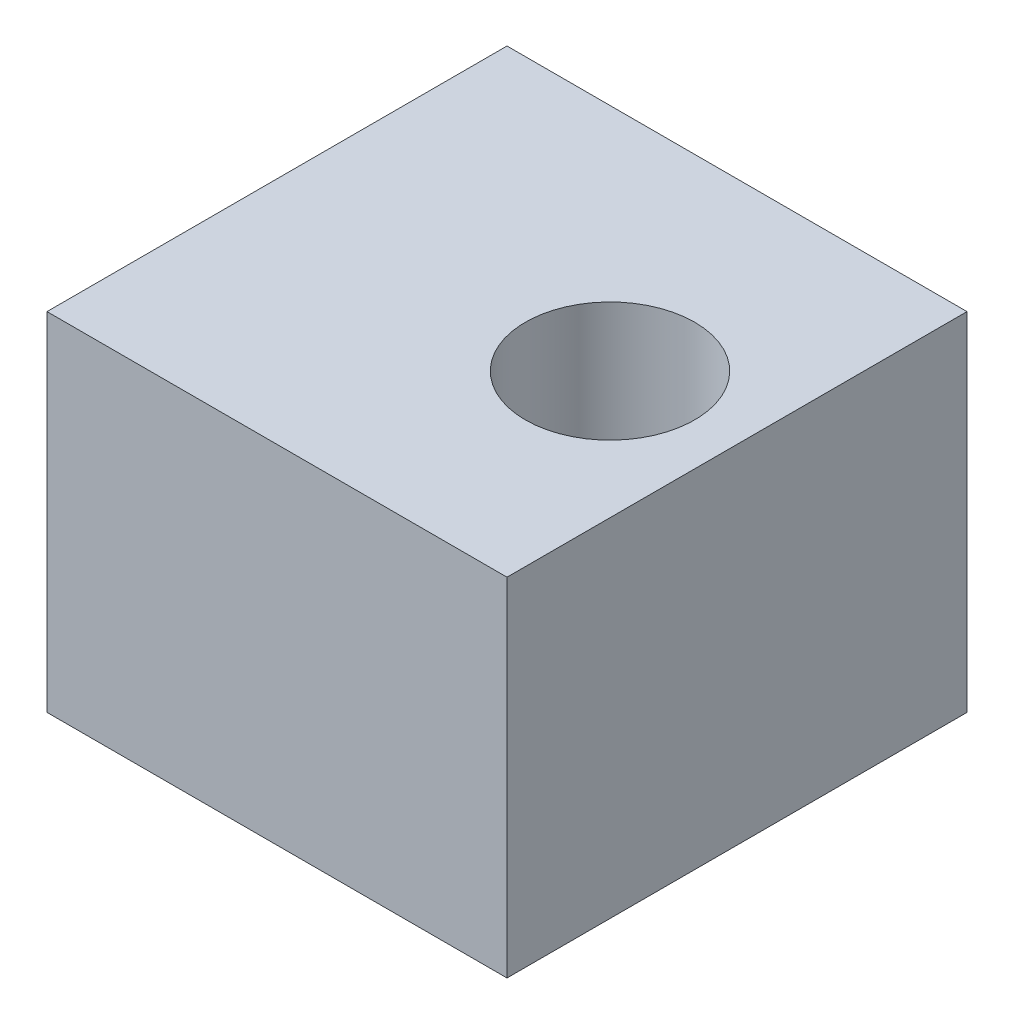
ISO-10303-21;
HEADER;
FILE_DESCRIPTION(('STEP AP214'),'2;1');
FILE_NAME('part.step','',(''),(''),'','','');
FILE_SCHEMA(('AUTOMOTIVE_DESIGN { 1 0 10303 214 1 1 1 1 }'));
ENDSEC;
DATA;
#1=APPLICATION_CONTEXT('core data for automotive mechanical design processes');
#2=APPLICATION_PROTOCOL_DEFINITION('international standard','automotive_design',2000,#1);
#3=PRODUCT_CONTEXT('',#1,'mechanical');
#4=PRODUCT('Part','Part','',(#3));
#5=PRODUCT_RELATED_PRODUCT_CATEGORY('part','',(#4));
#6=PRODUCT_DEFINITION_FORMATION('','',#4);
#7=PRODUCT_DEFINITION_CONTEXT('part definition',#1,'design');
#8=PRODUCT_DEFINITION('design','',#6,#7);
#9=PRODUCT_DEFINITION_SHAPE('','',#8);
#10=(LENGTH_UNIT() NAMED_UNIT(*) SI_UNIT(.MILLI.,.METRE.));
#11=(NAMED_UNIT(*) PLANE_ANGLE_UNIT() SI_UNIT($,.RADIAN.));
#12=(NAMED_UNIT(*) SI_UNIT($,.STERADIAN.) SOLID_ANGLE_UNIT());
#13=UNCERTAINTY_MEASURE_WITH_UNIT(LENGTH_MEASURE(1.E-05),#10,'distance_accuracy_value','');
#14=(GEOMETRIC_REPRESENTATION_CONTEXT(3) GLOBAL_UNCERTAINTY_ASSIGNED_CONTEXT((#13)) GLOBAL_UNIT_ASSIGNED_CONTEXT((#10,
#11,#12)) REPRESENTATION_CONTEXT('',''));
#15=CARTESIAN_POINT('',(0.,0.,0.));
#16=DIRECTION('',(0.,0.,1.));
#17=DIRECTION('',(1.,0.,0.));
#18=AXIS2_PLACEMENT_3D('',#15,#16,#17);
#19=CARTESIAN_POINT('',(8.15,12.3,8.15));
#20=DIRECTION('',(-1.,0.,0.));
#21=DIRECTION('',(0.,0.,1.));
#22=AXIS2_PLACEMENT_3D('',#19,#20,#21);
#23=PLANE('',#22);
#24=DIRECTION('',(0.,0.,-1.));
#25=VECTOR('',#24,1.);
#26=CARTESIAN_POINT('',(8.15,0.,8.15));
#27=LINE('',#26,#25);
#28=CARTESIAN_POINT('',(8.15,0.,8.15));
#29=VERTEX_POINT('',#28);
#30=CARTESIAN_POINT('',(8.15,0.,-8.15));
#31=VERTEX_POINT('',#30);
#32=EDGE_CURVE('E96',#29,#31,#27,.T.);
#33=ORIENTED_EDGE('',*,*,#32,.T.);
#34=DIRECTION('',(0.,-1.,0.));
#35=VECTOR('',#34,1.);
#36=CARTESIAN_POINT('',(8.15,12.3,-8.15));
#37=LINE('',#36,#35);
#38=CARTESIAN_POINT('',(8.15,12.3,-8.15));
#39=VERTEX_POINT('',#38);
#40=EDGE_CURVE('E11',#39,#31,#37,.T.);
#41=ORIENTED_EDGE('',*,*,#40,.F.);
#42=DIRECTION('',(0.,0.,-1.));
#43=VECTOR('',#42,1.);
#44=CARTESIAN_POINT('',(8.15,12.3,8.15));
#45=LINE('',#44,#43);
#46=CARTESIAN_POINT('',(8.15,12.3,8.15));
#47=VERTEX_POINT('',#46);
#48=EDGE_CURVE('E84',#47,#39,#45,.T.);
#49=ORIENTED_EDGE('',*,*,#48,.F.);
#50=DIRECTION('',(0.,-1.,0.));
#51=VECTOR('',#50,1.);
#52=CARTESIAN_POINT('',(8.15,12.3,8.15));
#53=LINE('',#52,#51);
#54=EDGE_CURVE('E92',#47,#29,#53,.T.);
#55=ORIENTED_EDGE('',*,*,#54,.T.);
#56=EDGE_LOOP('',(#33,#41,#49,#55));
#57=FACE_BOUND('',#56,.T.);
#58=ADVANCED_FACE('F33',(#57),#23,.F.);
#59=CARTESIAN_POINT('',(-8.15,12.3,-8.15));
#60=DIRECTION('',(0.,0.,1.));
#61=DIRECTION('',(1.,0.,0.));
#62=AXIS2_PLACEMENT_3D('',#59,#60,#61);
#63=PLANE('',#62);
#64=DIRECTION('',(-1.,0.,0.));
#65=VECTOR('',#64,1.);
#66=CARTESIAN_POINT('',(-8.15,0.,-8.15));
#67=LINE('',#66,#65);
#68=CARTESIAN_POINT('',(-8.15,0.,-8.15));
#69=VERTEX_POINT('',#68);
#70=EDGE_CURVE('E88',#31,#69,#67,.T.);
#71=ORIENTED_EDGE('',*,*,#70,.T.);
#72=DIRECTION('',(0.,-1.,0.));
#73=VECTOR('',#72,1.);
#74=CARTESIAN_POINT('',(-8.15,12.3,-8.15));
#75=LINE('',#74,#73);
#76=CARTESIAN_POINT('',(-8.15,12.3,-8.15));
#77=VERTEX_POINT('',#76);
#78=EDGE_CURVE('E41',#77,#69,#75,.T.);
#79=ORIENTED_EDGE('',*,*,#78,.F.);
#80=DIRECTION('',(-1.,0.,0.));
#81=VECTOR('',#80,1.);
#82=CARTESIAN_POINT('',(-8.15,12.3,-8.15));
#83=LINE('',#82,#81);
#84=EDGE_CURVE('E79',#39,#77,#83,.T.);
#85=ORIENTED_EDGE('',*,*,#84,.F.);
#86=ORIENTED_EDGE('',*,*,#40,.T.);
#87=EDGE_LOOP('',(#71,#79,#85,#86));
#88=FACE_BOUND('',#87,.T.);
#89=ADVANCED_FACE('F87',(#88),#63,.F.);
#90=CARTESIAN_POINT('',(-8.15,12.3,8.15));
#91=DIRECTION('',(1.,0.,0.));
#92=DIRECTION('',(0.,0.,-1.));
#93=AXIS2_PLACEMENT_3D('',#90,#91,#92);
#94=PLANE('',#93);
#95=DIRECTION('',(0.,0.,1.));
#96=VECTOR('',#95,1.);
#97=CARTESIAN_POINT('',(-8.15,0.,8.15));
#98=LINE('',#97,#96);
#99=CARTESIAN_POINT('',(-8.15,0.,8.15));
#100=VERTEX_POINT('',#99);
#101=EDGE_CURVE('E66',#69,#100,#98,.T.);
#102=ORIENTED_EDGE('',*,*,#101,.T.);
#103=DIRECTION('',(0.,-1.,0.));
#104=VECTOR('',#103,1.);
#105=CARTESIAN_POINT('',(-8.15,12.3,8.15));
#106=LINE('',#105,#104);
#107=CARTESIAN_POINT('',(-8.15,12.3,8.15));
#108=VERTEX_POINT('',#107);
#109=EDGE_CURVE('E89',#108,#100,#106,.T.);
#110=ORIENTED_EDGE('',*,*,#109,.F.);
#111=DIRECTION('',(0.,0.,1.));
#112=VECTOR('',#111,1.);
#113=CARTESIAN_POINT('',(-8.15,12.3,8.15));
#114=LINE('',#113,#112);
#115=EDGE_CURVE('E82',#77,#108,#114,.T.);
#116=ORIENTED_EDGE('',*,*,#115,.F.);
#117=ORIENTED_EDGE('',*,*,#78,.T.);
#118=EDGE_LOOP('',(#102,#110,#116,#117));
#119=FACE_BOUND('',#118,.T.);
#120=ADVANCED_FACE('F90',(#119),#94,.F.);
#121=CARTESIAN_POINT('',(-8.15,12.3,8.15));
#122=DIRECTION('',(0.,0.,-1.));
#123=DIRECTION('',(-1.,0.,0.));
#124=AXIS2_PLACEMENT_3D('',#121,#122,#123);
#125=PLANE('',#124);
#126=DIRECTION('',(1.,0.,0.));
#127=VECTOR('',#126,1.);
#128=CARTESIAN_POINT('',(-8.15,0.,8.15));
#129=LINE('',#128,#127);
#130=EDGE_CURVE('E72',#100,#29,#129,.T.);
#131=ORIENTED_EDGE('',*,*,#130,.T.);
#132=ORIENTED_EDGE('',*,*,#54,.F.);
#133=DIRECTION('',(1.,0.,0.));
#134=VECTOR('',#133,1.);
#135=CARTESIAN_POINT('',(-8.15,12.3,8.15));
#136=LINE('',#135,#134);
#137=EDGE_CURVE('E49',#108,#47,#136,.T.);
#138=ORIENTED_EDGE('',*,*,#137,.F.);
#139=ORIENTED_EDGE('',*,*,#109,.T.);
#140=EDGE_LOOP('',(#131,#132,#138,#139));
#141=FACE_BOUND('',#140,.T.);
#142=ADVANCED_FACE('F104',(#141),#125,.F.);
#143=CARTESIAN_POINT('',(0.,12.3,0.));
#144=DIRECTION('',(0.,-1.,0.));
#145=DIRECTION('',(0.,0.,-1.));
#146=AXIS2_PLACEMENT_3D('',#143,#144,#145);
#147=PLANE('',#146);
#148=CARTESIAN_POINT('',(3.65,12.3,0.));
#149=DIRECTION('',(0.,-1.,0.));
#150=DIRECTION('',(0.,0.,-1.));
#151=AXIS2_PLACEMENT_3D('',#148,#149,#150);
#152=CIRCLE('',#151,3.);
#153=CARTESIAN_POINT('',(3.65,12.3,-3.));
#154=VERTEX_POINT('',#153);
#155=EDGE_CURVE('E99',#154,#154,#152,.T.);
#156=ORIENTED_EDGE('',*,*,#155,.T.);
#157=EDGE_LOOP('',(#156));
#158=FACE_BOUND('',#157,.T.);
#159=ORIENTED_EDGE('',*,*,#48,.T.);
#160=ORIENTED_EDGE('',*,*,#84,.T.);
#161=ORIENTED_EDGE('',*,*,#115,.T.);
#162=ORIENTED_EDGE('',*,*,#137,.T.);
#163=EDGE_LOOP('',(#159,#160,#161,#162));
#164=FACE_BOUND('',#163,.T.);
#165=ADVANCED_FACE('F80',(#158,#164),#147,.F.);
#166=CARTESIAN_POINT('',(0.,0.,0.));
#167=DIRECTION('',(0.,-1.,0.));
#168=DIRECTION('',(0.,0.,-1.));
#169=AXIS2_PLACEMENT_3D('',#166,#167,#168);
#170=PLANE('',#169);
#171=CARTESIAN_POINT('',(3.65,0.,0.));
#172=DIRECTION('',(0.,1.,0.));
#173=DIRECTION('',(0.,0.,1.));
#174=AXIS2_PLACEMENT_3D('',#171,#172,#173);
#175=CIRCLE('',#174,3.);
#176=CARTESIAN_POINT('',(3.65,0.,3.));
#177=VERTEX_POINT('',#176);
#178=EDGE_CURVE('E112',#177,#177,#175,.T.);
#179=ORIENTED_EDGE('',*,*,#178,.T.);
#180=EDGE_LOOP('',(#179));
#181=FACE_BOUND('',#180,.T.);
#182=ORIENTED_EDGE('',*,*,#32,.F.);
#183=ORIENTED_EDGE('',*,*,#130,.F.);
#184=ORIENTED_EDGE('',*,*,#101,.F.);
#185=ORIENTED_EDGE('',*,*,#70,.F.);
#186=EDGE_LOOP('',(#182,#183,#184,#185));
#187=FACE_BOUND('',#186,.T.);
#188=ADVANCED_FACE('F107',(#181,#187),#170,.T.);
#189=CARTESIAN_POINT('',(3.65,20.7852813742386,0.));
#190=DIRECTION('',(0.,-1.,0.));
#191=DIRECTION('',(0.,0.,-1.));
#192=AXIS2_PLACEMENT_3D('',#189,#190,#191);
#193=CYLINDRICAL_SURFACE('',#192,3.);
#194=ORIENTED_EDGE('',*,*,#155,.F.);
#195=EDGE_LOOP('',(#194));
#196=FACE_BOUND('',#195,.T.);
#197=ORIENTED_EDGE('',*,*,#178,.F.);
#198=EDGE_LOOP('',(#197));
#199=FACE_BOUND('',#198,.T.);
#200=ADVANCED_FACE('F117',(#196,#199),#193,.F.);
#201=CLOSED_SHELL('',(#58,#89,#120,#142,#165,#188,#200));
#202=MANIFOLD_SOLID_BREP('B2',#201);
#203=ADVANCED_BREP_SHAPE_REPRESENTATION('',(#18,#202),#14);
#204=SHAPE_DEFINITION_REPRESENTATION(#9,#203);
ENDSEC;
END-ISO-10303-21;
